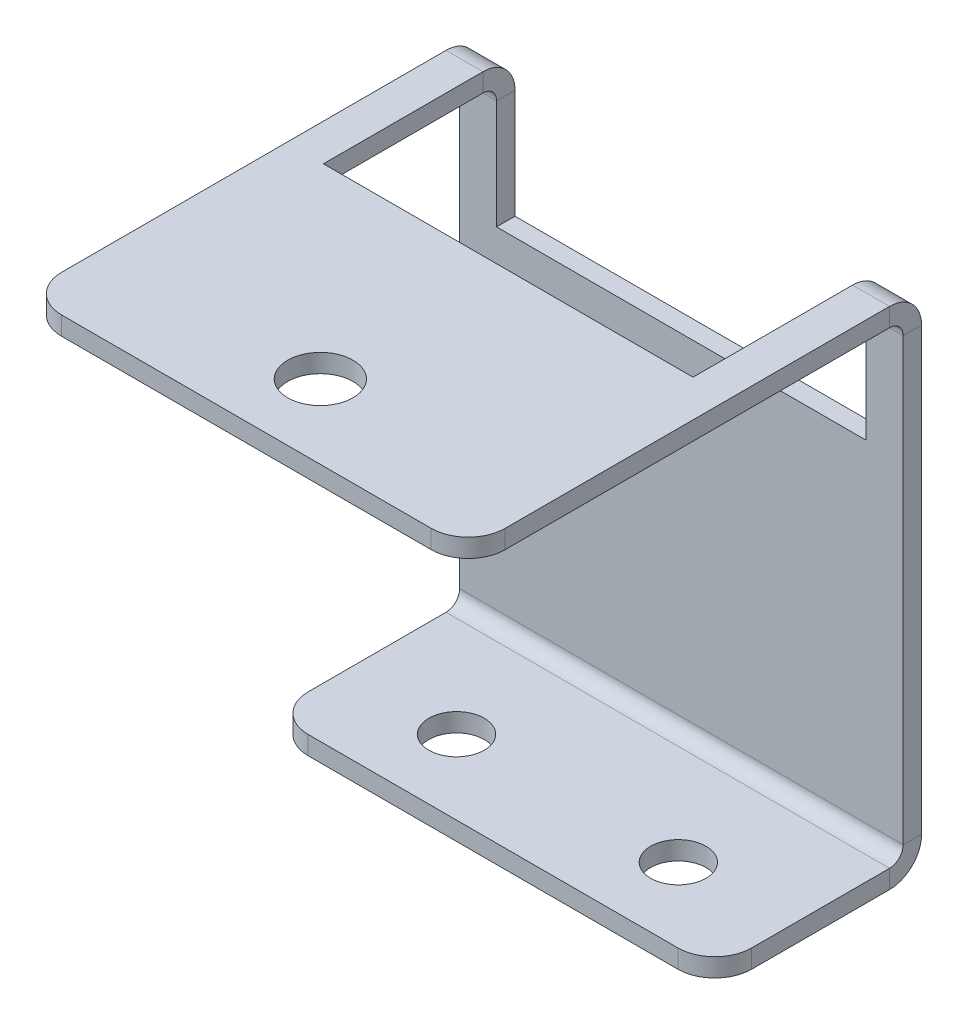
ISO-10303-21;
HEADER;
FILE_DESCRIPTION(('STEP AP214'),'2;1');
FILE_NAME('part.step','',(''),(''),'','','');
FILE_SCHEMA(('AUTOMOTIVE_DESIGN { 1 0 10303 214 1 1 1 1 }'));
ENDSEC;
DATA;
#1=APPLICATION_CONTEXT('core data for automotive mechanical design processes');
#2=APPLICATION_PROTOCOL_DEFINITION('international standard','automotive_design',2000,#1);
#3=PRODUCT_CONTEXT('',#1,'mechanical');
#4=PRODUCT('Part','Part','',(#3));
#5=PRODUCT_RELATED_PRODUCT_CATEGORY('part','',(#4));
#6=PRODUCT_DEFINITION_FORMATION('','',#4);
#7=PRODUCT_DEFINITION_CONTEXT('part definition',#1,'design');
#8=PRODUCT_DEFINITION('design','',#6,#7);
#9=PRODUCT_DEFINITION_SHAPE('','',#8);
#10=(LENGTH_UNIT() NAMED_UNIT(*) SI_UNIT(.MILLI.,.METRE.));
#11=(NAMED_UNIT(*) PLANE_ANGLE_UNIT() SI_UNIT($,.RADIAN.));
#12=(NAMED_UNIT(*) SI_UNIT($,.STERADIAN.) SOLID_ANGLE_UNIT());
#13=UNCERTAINTY_MEASURE_WITH_UNIT(LENGTH_MEASURE(1.E-05),#10,'distance_accuracy_value','');
#14=(GEOMETRIC_REPRESENTATION_CONTEXT(3) GLOBAL_UNCERTAINTY_ASSIGNED_CONTEXT((#13)) GLOBAL_UNIT_ASSIGNED_CONTEXT((#10,
#11,#12)) REPRESENTATION_CONTEXT('',''));
#15=CARTESIAN_POINT('',(0.,0.,0.));
#16=DIRECTION('',(0.,0.,1.));
#17=DIRECTION('',(1.,0.,0.));
#18=AXIS2_PLACEMENT_3D('',#15,#16,#17);
#19=CARTESIAN_POINT('',(-17.245017891848,-41.98679348364,-1.));
#20=DIRECTION('',(0.,0.,1.));
#21=DIRECTION('',(1.,0.,0.));
#22=AXIS2_PLACEMENT_3D('',#19,#20,#21);
#23=PLANE('',#22);
#24=DIRECTION('',(0.,-1.,0.));
#25=VECTOR('',#24,1.);
#26=CARTESIAN_POINT('',(-19.245017891848,14.01320651636,-1.));
#27=LINE('',#26,#25);
#28=CARTESIAN_POINT('',(-19.245017891848,-8.7292653526373,-1.));
#29=VERTEX_POINT('',#28);
#30=CARTESIAN_POINT('',(-19.245017891848,-32.58974198378,-0.999999999999999));
#31=VERTEX_POINT('',#30);
#32=EDGE_CURVE('E346',#29,#31,#27,.T.);
#33=ORIENTED_EDGE('',*,*,#32,.F.);
#34=DIRECTION('',(1.,0.,0.));
#35=VECTOR('',#34,1.);
#36=CARTESIAN_POINT('',(-17.245017891848,-8.72926535263729,-1.));
#37=LINE('',#36,#35);
#38=CARTESIAN_POINT('',(-17.245017891848,-8.72926535263729,-1.));
#39=VERTEX_POINT('',#38);
#40=EDGE_CURVE('E423',#29,#39,#37,.T.);
#41=ORIENTED_EDGE('',*,*,#40,.T.);
#42=DIRECTION('',(0.,-1.,0.));
#43=VECTOR('',#42,1.);
#44=CARTESIAN_POINT('',(-17.245017891848,-14.6335342843049,-1.));
#45=LINE('',#44,#43);
#46=CARTESIAN_POINT('',(-17.245017891848,-14.6335342843049,-1.));
#47=VERTEX_POINT('',#46);
#48=EDGE_CURVE('E347',#39,#47,#45,.T.);
#49=ORIENTED_EDGE('',*,*,#48,.T.);
#50=DIRECTION('',(1.,0.,0.));
#51=VECTOR('',#50,1.);
#52=CARTESIAN_POINT('',(2.75498210815198,-14.6335342843049,-1.));
#53=LINE('',#52,#51);
#54=CARTESIAN_POINT('',(2.75498210815198,-14.6335342843049,-1.));
#55=VERTEX_POINT('',#54);
#56=EDGE_CURVE('E348',#47,#55,#53,.T.);
#57=ORIENTED_EDGE('',*,*,#56,.T.);
#58=DIRECTION('',(0.,1.,0.));
#59=VECTOR('',#58,1.);
#60=CARTESIAN_POINT('',(2.75498210815197,1.84429695847216,-1.));
#61=LINE('',#60,#59);
#62=CARTESIAN_POINT('',(2.75498210815198,-8.72926535263729,-1.));
#63=VERTEX_POINT('',#62);
#64=EDGE_CURVE('E51',#55,#63,#61,.T.);
#65=ORIENTED_EDGE('',*,*,#64,.T.);
#66=DIRECTION('',(1.,0.,0.));
#67=VECTOR('',#66,1.);
#68=CARTESIAN_POINT('',(-17.245017891848,-8.72926535263729,-1.));
#69=LINE('',#68,#67);
#70=CARTESIAN_POINT('',(4.75498210815198,-8.72926535263728,-1.));
#71=VERTEX_POINT('',#70);
#72=EDGE_CURVE('E438',#63,#71,#69,.T.);
#73=ORIENTED_EDGE('',*,*,#72,.T.);
#74=DIRECTION('',(0.,1.,0.));
#75=VECTOR('',#74,1.);
#76=CARTESIAN_POINT('',(4.75498210815199,-41.98679348364,-1.));
#77=LINE('',#76,#75);
#78=CARTESIAN_POINT('',(4.75498210815199,-32.58974198378,-1.));
#79=VERTEX_POINT('',#78);
#80=EDGE_CURVE('E375',#79,#71,#77,.T.);
#81=ORIENTED_EDGE('',*,*,#80,.F.);
#82=DIRECTION('',(-1.,0.,0.));
#83=VECTOR('',#82,1.);
#84=CARTESIAN_POINT('',(-17.245017891848,-32.58974198378,-1.));
#85=LINE('',#84,#83);
#86=EDGE_CURVE('E343',#79,#31,#85,.T.);
#87=ORIENTED_EDGE('',*,*,#86,.T.);
#88=EDGE_LOOP('',(#33,#41,#49,#57,#65,#73,#81,#87));
#89=FACE_BOUND('',#88,.T.);
#90=ADVANCED_FACE('F47',(#89),#23,.F.);
#91=CARTESIAN_POINT('',(2.75498210815197,1.84429695847216,-1.));
#92=DIRECTION('',(1.,0.,0.));
#93=DIRECTION('',(0.,1.,0.));
#94=AXIS2_PLACEMENT_3D('',#91,#92,#93);
#95=PLANE('',#94);
#96=DIRECTION('',(0.,1.,0.));
#97=VECTOR('',#96,1.);
#98=CARTESIAN_POINT('',(2.75498210815197,1.84429695847216,0.));
#99=LINE('',#98,#97);
#100=CARTESIAN_POINT('',(2.75498210815198,-14.6335342843049,0.));
#101=VERTEX_POINT('',#100);
#102=CARTESIAN_POINT('',(2.75498210815198,-8.72926535263729,0.));
#103=VERTEX_POINT('',#102);
#104=EDGE_CURVE('E72',#101,#103,#99,.T.);
#105=ORIENTED_EDGE('',*,*,#104,.T.);
#106=DIRECTION('',(0.,0.,-1.));
#107=VECTOR('',#106,1.);
#108=CARTESIAN_POINT('',(2.75498210815198,-8.72926535263729,-1.00000000000007));
#109=LINE('',#108,#107);
#110=EDGE_CURVE('E441',#103,#63,#109,.T.);
#111=ORIENTED_EDGE('',*,*,#110,.T.);
#112=ORIENTED_EDGE('',*,*,#64,.F.);
#113=DIRECTION('',(0.,0.,1.));
#114=VECTOR('',#113,1.);
#115=CARTESIAN_POINT('',(2.75498210815198,-14.6335342843049,-1.));
#116=LINE('',#115,#114);
#117=EDGE_CURVE('E357',#55,#101,#116,.T.);
#118=ORIENTED_EDGE('',*,*,#117,.T.);
#119=EDGE_LOOP('',(#105,#111,#112,#118));
#120=FACE_BOUND('',#119,.T.);
#121=ADVANCED_FACE('F460',(#120),#95,.F.);
#122=CARTESIAN_POINT('',(-17.245017891848,-14.6335342843049,-1.));
#123=DIRECTION('',(-1.,0.,0.));
#124=DIRECTION('',(0.,0.,1.));
#125=AXIS2_PLACEMENT_3D('',#122,#123,#124);
#126=PLANE('',#125);
#127=ORIENTED_EDGE('',*,*,#48,.F.);
#128=DIRECTION('',(0.,0.,1.));
#129=VECTOR('',#128,1.);
#130=CARTESIAN_POINT('',(-17.245017891848,-8.72926535263729,-0.999999999999959));
#131=LINE('',#130,#129);
#132=CARTESIAN_POINT('',(-17.245017891848,-8.72926535263729,0.));
#133=VERTEX_POINT('',#132);
#134=EDGE_CURVE('E435',#39,#133,#131,.T.);
#135=ORIENTED_EDGE('',*,*,#134,.T.);
#136=DIRECTION('',(0.,-1.,0.));
#137=VECTOR('',#136,1.);
#138=CARTESIAN_POINT('',(-17.245017891848,-14.6335342843049,0.));
#139=LINE('',#138,#137);
#140=CARTESIAN_POINT('',(-17.245017891848,-14.6335342843049,0.));
#141=VERTEX_POINT('',#140);
#142=EDGE_CURVE('E362',#133,#141,#139,.T.);
#143=ORIENTED_EDGE('',*,*,#142,.T.);
#144=DIRECTION('',(0.,0.,1.));
#145=VECTOR('',#144,1.);
#146=CARTESIAN_POINT('',(-17.245017891848,-14.6335342843049,-1.));
#147=LINE('',#146,#145);
#148=EDGE_CURVE('E351',#47,#141,#147,.T.);
#149=ORIENTED_EDGE('',*,*,#148,.F.);
#150=EDGE_LOOP('',(#127,#135,#143,#149));
#151=FACE_BOUND('',#150,.T.);
#152=ADVANCED_FACE('F49',(#151),#126,.F.);
#153=CARTESIAN_POINT('',(-19.245017891848,-34.3263419837802,-47.8087952378546));
#154=DIRECTION('',(-1.,0.,0.));
#155=DIRECTION('',(0.,0.,1.));
#156=AXIS2_PLACEMENT_3D('',#153,#154,#155);
#157=PLANE('',#156);
#158=DIRECTION('',(0.,0.,1.));
#159=VECTOR('',#158,1.);
#160=CARTESIAN_POINT('',(-19.245017891848,-33.3263419837802,-47.8087952378546));
#161=LINE('',#160,#159);
#162=CARTESIAN_POINT('',(-19.245017891848,-33.32634198378,0.736600000000004));
#163=VERTEX_POINT('',#162);
#164=CARTESIAN_POINT('',(-19.245017891848,-33.32634198378,8.19120476214537));
#165=VERTEX_POINT('',#164);
#166=EDGE_CURVE('E386',#163,#165,#161,.T.);
#167=ORIENTED_EDGE('',*,*,#166,.F.);
#168=DIRECTION('',(0.,-1.,0.));
#169=VECTOR('',#168,1.);
#170=CARTESIAN_POINT('',(-19.245017891848,-34.3263419837804,0.736600000000004));
#171=LINE('',#170,#169);
#172=CARTESIAN_POINT('',(-19.245017891848,-34.32634198378,0.736600000000002));
#173=VERTEX_POINT('',#172);
#174=EDGE_CURVE('E415',#163,#173,#171,.T.);
#175=ORIENTED_EDGE('',*,*,#174,.T.);
#176=DIRECTION('',(0.,0.,1.));
#177=VECTOR('',#176,1.);
#178=CARTESIAN_POINT('',(-19.245017891848,-34.3263419837802,-47.8087952378546));
#179=LINE('',#178,#177);
#180=CARTESIAN_POINT('',(-19.245017891848,-34.32634198378,8.19120476214538));
#181=VERTEX_POINT('',#180);
#182=EDGE_CURVE('E412',#173,#181,#179,.T.);
#183=ORIENTED_EDGE('',*,*,#182,.T.);
#184=DIRECTION('',(0.,1.,0.));
#185=VECTOR('',#184,1.);
#186=CARTESIAN_POINT('',(-19.245017891848,-34.32634198378,8.19120476214538));
#187=LINE('',#186,#185);
#188=EDGE_CURVE('E402',#181,#165,#187,.T.);
#189=ORIENTED_EDGE('',*,*,#188,.T.);
#190=EDGE_LOOP('',(#167,#175,#183,#189));
#191=FACE_BOUND('',#190,.T.);
#192=ADVANCED_FACE('F508',(#191),#157,.T.);
#193=CARTESIAN_POINT('',(4.75498210815199,-34.32634198378,8.19120476214538));
#194=DIRECTION('',(1.,0.,0.));
#195=DIRECTION('',(0.,0.,-1.));
#196=AXIS2_PLACEMENT_3D('',#193,#194,#195);
#197=PLANE('',#196);
#198=DIRECTION('',(0.,0.,-1.));
#199=VECTOR('',#198,1.);
#200=CARTESIAN_POINT('',(4.75498210815199,-34.32634198378,8.19120476214538));
#201=LINE('',#200,#199);
#202=CARTESIAN_POINT('',(4.75498210815199,-34.32634198378,8.19120476214538));
#203=VERTEX_POINT('',#202);
#204=CARTESIAN_POINT('',(4.75498210815199,-34.32634198378,0.736600000000004));
#205=VERTEX_POINT('',#204);
#206=EDGE_CURVE('E392',#203,#205,#201,.T.);
#207=ORIENTED_EDGE('',*,*,#206,.T.);
#208=DIRECTION('',(0.,1.,0.));
#209=VECTOR('',#208,1.);
#210=CARTESIAN_POINT('',(4.75498210815199,-34.32634198378,0.736600000000004));
#211=LINE('',#210,#209);
#212=CARTESIAN_POINT('',(4.75498210815199,-33.32634198378,0.736600000000004));
#213=VERTEX_POINT('',#212);
#214=EDGE_CURVE('E420',#205,#213,#211,.T.);
#215=ORIENTED_EDGE('',*,*,#214,.T.);
#216=DIRECTION('',(0.,0.,-1.));
#217=VECTOR('',#216,1.);
#218=CARTESIAN_POINT('',(4.75498210815199,-33.32634198378,8.19120476214537));
#219=LINE('',#218,#217);
#220=CARTESIAN_POINT('',(4.75498210815199,-33.32634198378,8.19120476214537));
#221=VERTEX_POINT('',#220);
#222=EDGE_CURVE('E401',#221,#213,#219,.T.);
#223=ORIENTED_EDGE('',*,*,#222,.F.);
#224=DIRECTION('',(0.,1.,0.));
#225=VECTOR('',#224,1.);
#226=CARTESIAN_POINT('',(4.75498210815199,-34.32634198378,8.19120476214538));
#227=LINE('',#226,#225);
#228=EDGE_CURVE('E406',#203,#221,#227,.T.);
#229=ORIENTED_EDGE('',*,*,#228,.F.);
#230=EDGE_LOOP('',(#207,#215,#223,#229));
#231=FACE_BOUND('',#230,.T.);
#232=ADVANCED_FACE('F497',(#231),#197,.T.);
#233=CARTESIAN_POINT('',(-17.245017891848,-33.32634198378,8.19120476214538));
#234=DIRECTION('',(0.,1.,0.));
#235=DIRECTION('',(1.,0.,0.));
#236=AXIS2_PLACEMENT_3D('',#233,#234,#235);
#237=PLANE('',#236);
#238=CARTESIAN_POINT('',(-13.245017891848,-33.32634198378,6.16537663114272));
#239=DIRECTION('',(0.,1.,0.));
#240=DIRECTION('',(1.,0.,0.));
#241=AXIS2_PLACEMENT_3D('',#238,#239,#240);
#242=CIRCLE('',#241,1.5);
#243=CARTESIAN_POINT('',(-11.745017891848,-33.32634198378,6.16537663114272));
#244=VERTEX_POINT('',#243);
#245=EDGE_CURVE('E371',#244,#244,#242,.T.);
#246=ORIENTED_EDGE('',*,*,#245,.F.);
#247=EDGE_LOOP('',(#246));
#248=FACE_BOUND('',#247,.T.);
#249=CARTESIAN_POINT('',(-1.24501789184801,-33.32634198378,6.16537663114272));
#250=DIRECTION('',(0.,1.,0.));
#251=DIRECTION('',(1.,0.,0.));
#252=AXIS2_PLACEMENT_3D('',#249,#250,#251);
#253=CIRCLE('',#252,1.5);
#254=CARTESIAN_POINT('',(0.254982108151987,-33.32634198378,6.16537663114272));
#255=VERTEX_POINT('',#254);
#256=EDGE_CURVE('E372',#255,#255,#253,.T.);
#257=ORIENTED_EDGE('',*,*,#256,.F.);
#258=EDGE_LOOP('',(#257));
#259=FACE_BOUND('',#258,.T.);
#260=ORIENTED_EDGE('',*,*,#222,.T.);
#261=DIRECTION('',(-1.,0.,0.));
#262=VECTOR('',#261,1.);
#263=CARTESIAN_POINT('',(-17.245017891848,-33.32634198378,0.736600000000004));
#264=LINE('',#263,#262);
#265=EDGE_CURVE('E417',#213,#163,#264,.T.);
#266=ORIENTED_EDGE('',*,*,#265,.T.);
#267=ORIENTED_EDGE('',*,*,#166,.T.);
#268=CARTESIAN_POINT('',(-17.245017891848,-33.32634198378,8.19120476214538));
#269=DIRECTION('',(0.,1.,0.));
#270=DIRECTION('',(1.,0.,0.));
#271=AXIS2_PLACEMENT_3D('',#268,#269,#270);
#272=CIRCLE('',#271,2.);
#273=CARTESIAN_POINT('',(-17.245017891848,-33.32634198378,10.1912047621454));
#274=VERTEX_POINT('',#273);
#275=EDGE_CURVE('E379',#165,#274,#272,.T.);
#276=ORIENTED_EDGE('',*,*,#275,.T.);
#277=DIRECTION('',(1.,0.,0.));
#278=VECTOR('',#277,1.);
#279=CARTESIAN_POINT('',(-17.245017891848,-33.32634198378,10.1912047621454));
#280=LINE('',#279,#278);
#281=CARTESIAN_POINT('',(2.75498210815198,-33.32634198378,10.1912047621454));
#282=VERTEX_POINT('',#281);
#283=EDGE_CURVE('E395',#274,#282,#280,.T.);
#284=ORIENTED_EDGE('',*,*,#283,.T.);
#285=CARTESIAN_POINT('',(2.75498210815199,-33.32634198378,8.19120476214538));
#286=DIRECTION('',(0.,1.,0.));
#287=DIRECTION('',(-1.,0.,0.));
#288=AXIS2_PLACEMENT_3D('',#285,#286,#287);
#289=CIRCLE('',#288,2.);
#290=EDGE_CURVE('E398',#282,#221,#289,.T.);
#291=ORIENTED_EDGE('',*,*,#290,.T.);
#292=EDGE_LOOP('',(#260,#266,#267,#276,#284,#291));
#293=FACE_BOUND('',#292,.T.);
#294=ADVANCED_FACE('F506',(#248,#259,#293),#237,.T.);
#295=CARTESIAN_POINT('',(-17.245017891848,-34.32634198378,8.19120476214539));
#296=DIRECTION('',(0.,1.,0.));
#297=DIRECTION('',(1.,0.,0.));
#298=AXIS2_PLACEMENT_3D('',#295,#296,#297);
#299=CYLINDRICAL_SURFACE('',#298,2.);
#300=ORIENTED_EDGE('',*,*,#275,.F.);
#301=ORIENTED_EDGE('',*,*,#188,.F.);
#302=CARTESIAN_POINT('',(-17.245017891848,-34.32634198378,8.19120476214539));
#303=DIRECTION('',(0.,1.,0.));
#304=DIRECTION('',(1.,0.,0.));
#305=AXIS2_PLACEMENT_3D('',#302,#303,#304);
#306=CIRCLE('',#305,2.);
#307=CARTESIAN_POINT('',(-17.245017891848,-34.32634198378,10.1912047621454));
#308=VERTEX_POINT('',#307);
#309=EDGE_CURVE('E382',#181,#308,#306,.T.);
#310=ORIENTED_EDGE('',*,*,#309,.T.);
#311=DIRECTION('',(0.,1.,0.));
#312=VECTOR('',#311,1.);
#313=CARTESIAN_POINT('',(-17.245017891848,-34.32634198378,10.1912047621454));
#314=LINE('',#313,#312);
#315=EDGE_CURVE('E410',#308,#274,#314,.T.);
#316=ORIENTED_EDGE('',*,*,#315,.T.);
#317=EDGE_LOOP('',(#300,#301,#310,#316));
#318=FACE_BOUND('',#317,.T.);
#319=ADVANCED_FACE('F512',(#318),#299,.T.);
#320=CARTESIAN_POINT('',(2.75498210815199,-34.32634198378,8.19120476214539));
#321=DIRECTION('',(0.,1.,0.));
#322=DIRECTION('',(1.,0.,0.));
#323=AXIS2_PLACEMENT_3D('',#320,#321,#322);
#324=CYLINDRICAL_SURFACE('',#323,2.);
#325=ORIENTED_EDGE('',*,*,#290,.F.);
#326=DIRECTION('',(0.,1.,0.));
#327=VECTOR('',#326,1.);
#328=CARTESIAN_POINT('',(2.75498210815198,-34.32634198378,10.1912047621454));
#329=LINE('',#328,#327);
#330=CARTESIAN_POINT('',(2.75498210815198,-34.32634198378,10.1912047621454));
#331=VERTEX_POINT('',#330);
#332=EDGE_CURVE('E408',#331,#282,#329,.T.);
#333=ORIENTED_EDGE('',*,*,#332,.F.);
#334=CARTESIAN_POINT('',(2.75498210815199,-34.32634198378,8.19120476214539));
#335=DIRECTION('',(0.,1.,0.));
#336=DIRECTION('',(-1.,0.,0.));
#337=AXIS2_PLACEMENT_3D('',#334,#335,#336);
#338=CIRCLE('',#337,2.);
#339=EDGE_CURVE('E389',#331,#203,#338,.T.);
#340=ORIENTED_EDGE('',*,*,#339,.T.);
#341=ORIENTED_EDGE('',*,*,#228,.T.);
#342=EDGE_LOOP('',(#325,#333,#340,#341));
#343=FACE_BOUND('',#342,.T.);
#344=ADVANCED_FACE('F519',(#343),#324,.T.);
#345=CARTESIAN_POINT('',(-17.245017891848,-34.32634198378,10.1912047621454));
#346=DIRECTION('',(0.,0.,1.));
#347=DIRECTION('',(0.,-1.,0.));
#348=AXIS2_PLACEMENT_3D('',#345,#346,#347);
#349=PLANE('',#348);
#350=ORIENTED_EDGE('',*,*,#283,.F.);
#351=ORIENTED_EDGE('',*,*,#315,.F.);
#352=DIRECTION('',(1.,0.,0.));
#353=VECTOR('',#352,1.);
#354=CARTESIAN_POINT('',(-17.245017891848,-34.32634198378,10.1912047621454));
#355=LINE('',#354,#353);
#356=EDGE_CURVE('E385',#308,#331,#355,.T.);
#357=ORIENTED_EDGE('',*,*,#356,.T.);
#358=ORIENTED_EDGE('',*,*,#332,.T.);
#359=EDGE_LOOP('',(#350,#351,#357,#358));
#360=FACE_BOUND('',#359,.T.);
#361=ADVANCED_FACE('F516',(#360),#349,.T.);
#362=CARTESIAN_POINT('',(-17.245017891848,-34.32634198378,8.19120476214539));
#363=DIRECTION('',(0.,1.,0.));
#364=DIRECTION('',(1.,0.,0.));
#365=AXIS2_PLACEMENT_3D('',#362,#363,#364);
#366=PLANE('',#365);
#367=DIRECTION('',(-1.,0.,0.));
#368=VECTOR('',#367,1.);
#369=CARTESIAN_POINT('',(-17.245017891848,-34.32634198378,0.736600000000004));
#370=LINE('',#369,#368);
#371=EDGE_CURVE('E405',#205,#173,#370,.T.);
#372=ORIENTED_EDGE('',*,*,#371,.F.);
#373=ORIENTED_EDGE('',*,*,#206,.F.);
#374=ORIENTED_EDGE('',*,*,#339,.F.);
#375=ORIENTED_EDGE('',*,*,#356,.F.);
#376=ORIENTED_EDGE('',*,*,#309,.F.);
#377=ORIENTED_EDGE('',*,*,#182,.F.);
#378=EDGE_LOOP('',(#372,#373,#374,#375,#376,#377));
#379=FACE_BOUND('',#378,.T.);
#380=CARTESIAN_POINT('',(-1.24501789184801,-34.32634198378,6.16537663114273));
#381=DIRECTION('',(0.,1.,0.));
#382=DIRECTION('',(1.,0.,0.));
#383=AXIS2_PLACEMENT_3D('',#380,#381,#382);
#384=CIRCLE('',#383,1.5);
#385=CARTESIAN_POINT('',(0.254982108151987,-34.32634198378,6.16537663114273));
#386=VERTEX_POINT('',#385);
#387=EDGE_CURVE('E368',#386,#386,#384,.T.);
#388=ORIENTED_EDGE('',*,*,#387,.T.);
#389=EDGE_LOOP('',(#388));
#390=FACE_BOUND('',#389,.T.);
#391=CARTESIAN_POINT('',(-13.245017891848,-34.32634198378,6.16537663114273));
#392=DIRECTION('',(0.,1.,0.));
#393=DIRECTION('',(1.,0.,0.));
#394=AXIS2_PLACEMENT_3D('',#391,#392,#393);
#395=CIRCLE('',#394,1.5);
#396=CARTESIAN_POINT('',(-11.745017891848,-34.32634198378,6.16537663114273));
#397=VERTEX_POINT('',#396);
#398=EDGE_CURVE('E376',#397,#397,#395,.T.);
#399=ORIENTED_EDGE('',*,*,#398,.T.);
#400=EDGE_LOOP('',(#399));
#401=FACE_BOUND('',#400,.T.);
#402=ADVANCED_FACE('F491',(#379,#390,#401),#366,.F.);
#403=CARTESIAN_POINT('',(-13.245017891848,-34.32634198378,6.16537663114273));
#404=DIRECTION('',(0.,1.,0.));
#405=DIRECTION('',(1.,0.,0.));
#406=AXIS2_PLACEMENT_3D('',#403,#404,#405);
#407=CYLINDRICAL_SURFACE('',#406,1.5);
#408=ORIENTED_EDGE('',*,*,#398,.F.);
#409=EDGE_LOOP('',(#408));
#410=FACE_BOUND('',#409,.T.);
#411=ORIENTED_EDGE('',*,*,#245,.T.);
#412=EDGE_LOOP('',(#411));
#413=FACE_BOUND('',#412,.T.);
#414=ADVANCED_FACE('F619',(#410,#413),#407,.F.);
#415=CARTESIAN_POINT('',(-1.24501789184801,-34.32634198378,6.16537663114273));
#416=DIRECTION('',(0.,1.,0.));
#417=DIRECTION('',(1.,0.,0.));
#418=AXIS2_PLACEMENT_3D('',#415,#416,#417);
#419=CYLINDRICAL_SURFACE('',#418,1.5);
#420=ORIENTED_EDGE('',*,*,#387,.F.);
#421=EDGE_LOOP('',(#420));
#422=FACE_BOUND('',#421,.T.);
#423=ORIENTED_EDGE('',*,*,#256,.T.);
#424=EDGE_LOOP('',(#423));
#425=FACE_BOUND('',#424,.T.);
#426=ADVANCED_FACE('F548',(#422,#425),#419,.F.);
#427=CARTESIAN_POINT('',(2.75498210815198,-14.6335342843049,-1.));
#428=DIRECTION('',(0.,-1.,0.));
#429=DIRECTION('',(1.,0.,0.));
#430=AXIS2_PLACEMENT_3D('',#427,#428,#429);
#431=PLANE('',#430);
#432=DIRECTION('',(1.,0.,0.));
#433=VECTOR('',#432,1.);
#434=CARTESIAN_POINT('',(2.75498210815198,-14.6335342843049,0.));
#435=LINE('',#434,#433);
#436=EDGE_CURVE('E354',#141,#101,#435,.T.);
#437=ORIENTED_EDGE('',*,*,#436,.T.);
#438=ORIENTED_EDGE('',*,*,#117,.F.);
#439=ORIENTED_EDGE('',*,*,#56,.F.);
#440=ORIENTED_EDGE('',*,*,#148,.T.);
#441=EDGE_LOOP('',(#437,#438,#439,#440));
#442=FACE_BOUND('',#441,.T.);
#443=ADVANCED_FACE('F544',(#442),#431,.F.);
#444=CARTESIAN_POINT('',(-19.245017891848,14.01320651636,-1.));
#445=DIRECTION('',(-1.,0.,0.));
#446=DIRECTION('',(0.,-1.,0.));
#447=AXIS2_PLACEMENT_3D('',#444,#445,#446);
#448=PLANE('',#447);
#449=DIRECTION('',(0.,0.,1.));
#450=VECTOR('',#449,1.);
#451=CARTESIAN_POINT('',(-19.245017891848,-8.72926535263729,-1.00000000000016));
#452=LINE('',#451,#450);
#453=CARTESIAN_POINT('',(-19.245017891848,-8.72926535263729,0.));
#454=VERTEX_POINT('',#453);
#455=EDGE_CURVE('E431',#29,#454,#452,.T.);
#456=ORIENTED_EDGE('',*,*,#455,.F.);
#457=ORIENTED_EDGE('',*,*,#32,.T.);
#458=DIRECTION('',(0.,0.,-1.));
#459=VECTOR('',#458,1.);
#460=CARTESIAN_POINT('',(-19.245017891848,-32.58974198378,-1.00000000000033));
#461=LINE('',#460,#459);
#462=CARTESIAN_POINT('',(-19.245017891848,-32.58974198378,0.));
#463=VERTEX_POINT('',#462);
#464=EDGE_CURVE('E359',#463,#31,#461,.T.);
#465=ORIENTED_EDGE('',*,*,#464,.F.);
#466=DIRECTION('',(0.,-1.,0.));
#467=VECTOR('',#466,1.);
#468=CARTESIAN_POINT('',(-19.245017891848,14.01320651636,0.));
#469=LINE('',#468,#467);
#470=EDGE_CURVE('E448',#454,#463,#469,.T.);
#471=ORIENTED_EDGE('',*,*,#470,.F.);
#472=EDGE_LOOP('',(#456,#457,#465,#471));
#473=FACE_BOUND('',#472,.T.);
#474=ADVANCED_FACE('F541',(#473),#448,.T.);
#475=CARTESIAN_POINT('',(-17.245017891848,-41.98679348364,0.));
#476=DIRECTION('',(0.,0.,1.));
#477=DIRECTION('',(1.,0.,0.));
#478=AXIS2_PLACEMENT_3D('',#475,#476,#477);
#479=PLANE('',#478);
#480=DIRECTION('',(1.,0.,0.));
#481=VECTOR('',#480,1.);
#482=CARTESIAN_POINT('',(-17.245017891848,-8.7292653526373,0.));
#483=LINE('',#482,#481);
#484=EDGE_CURVE('E433',#454,#133,#483,.T.);
#485=ORIENTED_EDGE('',*,*,#484,.F.);
#486=ORIENTED_EDGE('',*,*,#470,.T.);
#487=DIRECTION('',(-1.,0.,0.));
#488=VECTOR('',#487,1.);
#489=CARTESIAN_POINT('',(-17.245017891848,-32.58974198378,0.));
#490=LINE('',#489,#488);
#491=CARTESIAN_POINT('',(4.75498210815199,-32.58974198378,0.));
#492=VERTEX_POINT('',#491);
#493=EDGE_CURVE('E363',#492,#463,#490,.T.);
#494=ORIENTED_EDGE('',*,*,#493,.F.);
#495=DIRECTION('',(0.,1.,0.));
#496=VECTOR('',#495,1.);
#497=CARTESIAN_POINT('',(4.75498210815199,-41.98679348364,0.));
#498=LINE('',#497,#496);
#499=CARTESIAN_POINT('',(4.75498210815198,-8.7292653526373,0.));
#500=VERTEX_POINT('',#499);
#501=EDGE_CURVE('E64',#492,#500,#498,.T.);
#502=ORIENTED_EDGE('',*,*,#501,.T.);
#503=DIRECTION('',(1.,0.,0.));
#504=VECTOR('',#503,1.);
#505=CARTESIAN_POINT('',(-17.245017891848,-8.7292653526373,0.));
#506=LINE('',#505,#504);
#507=EDGE_CURVE('E56',#103,#500,#506,.T.);
#508=ORIENTED_EDGE('',*,*,#507,.F.);
#509=ORIENTED_EDGE('',*,*,#104,.F.);
#510=ORIENTED_EDGE('',*,*,#436,.F.);
#511=ORIENTED_EDGE('',*,*,#142,.F.);
#512=EDGE_LOOP('',(#485,#486,#494,#502,#508,#509,#510,#511));
#513=FACE_BOUND('',#512,.T.);
#514=ADVANCED_FACE('F538',(#513),#479,.T.);
#515=CARTESIAN_POINT('',(4.75498210815199,-41.98679348364,-1.));
#516=DIRECTION('',(1.,0.,0.));
#517=DIRECTION('',(0.,1.,0.));
#518=AXIS2_PLACEMENT_3D('',#515,#516,#517);
#519=PLANE('',#518);
#520=DIRECTION('',(0.,0.,-1.));
#521=VECTOR('',#520,1.);
#522=CARTESIAN_POINT('',(4.75498210815198,-8.72926535263729,-0.999999999999768));
#523=LINE('',#522,#521);
#524=EDGE_CURVE('E12',#500,#71,#523,.T.);
#525=ORIENTED_EDGE('',*,*,#524,.F.);
#526=ORIENTED_EDGE('',*,*,#501,.F.);
#527=DIRECTION('',(0.,0.,1.));
#528=VECTOR('',#527,1.);
#529=CARTESIAN_POINT('',(4.75498210815199,-32.58974198378,-0.999999999999934));
#530=LINE('',#529,#528);
#531=EDGE_CURVE('E338',#79,#492,#530,.T.);
#532=ORIENTED_EDGE('',*,*,#531,.F.);
#533=ORIENTED_EDGE('',*,*,#80,.T.);
#534=EDGE_LOOP('',(#525,#526,#532,#533));
#535=FACE_BOUND('',#534,.T.);
#536=ADVANCED_FACE('F473',(#535),#519,.T.);
#537=CARTESIAN_POINT('',(4.75498210815199,-32.58974198378,0.7366));
#538=DIRECTION('',(1.,0.,0.));
#539=DIRECTION('',(0.,0.,-1.));
#540=AXIS2_PLACEMENT_3D('',#537,#538,#539);
#541=PLANE('',#540);
#542=ORIENTED_EDGE('',*,*,#531,.T.);
#543=CARTESIAN_POINT('',(4.75498210815199,-32.58974198378,0.7366));
#544=DIRECTION('',(-1.,0.,0.));
#545=DIRECTION('',(0.,0.,1.));
#546=AXIS2_PLACEMENT_3D('',#543,#544,#545);
#547=CIRCLE('',#546,0.7366);
#548=EDGE_CURVE('E326',#492,#213,#547,.T.);
#549=ORIENTED_EDGE('',*,*,#548,.T.);
#550=ORIENTED_EDGE('',*,*,#214,.F.);
#551=CARTESIAN_POINT('',(4.75498210815199,-32.58974198378,0.7366));
#552=DIRECTION('',(-1.,0.,0.));
#553=DIRECTION('',(0.,0.,-1.));
#554=AXIS2_PLACEMENT_3D('',#551,#552,#553);
#555=CIRCLE('',#554,1.7366);
#556=EDGE_CURVE('E331',#79,#205,#555,.T.);
#557=ORIENTED_EDGE('',*,*,#556,.F.);
#558=EDGE_LOOP('',(#542,#549,#550,#557));
#559=FACE_BOUND('',#558,.T.);
#560=ADVANCED_FACE('F501',(#559),#541,.T.);
#561=CARTESIAN_POINT('',(-19.245017891848,-32.58974198378,0.7366));
#562=DIRECTION('',(-1.,0.,0.));
#563=DIRECTION('',(0.,0.,1.));
#564=AXIS2_PLACEMENT_3D('',#561,#562,#563);
#565=PLANE('',#564);
#566=ORIENTED_EDGE('',*,*,#174,.F.);
#567=CARTESIAN_POINT('',(-19.245017891848,-32.58974198378,0.7366));
#568=DIRECTION('',(-1.,0.,0.));
#569=DIRECTION('',(0.,0.,1.));
#570=AXIS2_PLACEMENT_3D('',#567,#568,#569);
#571=CIRCLE('',#570,0.7366);
#572=EDGE_CURVE('E335',#163,#463,#571,.F.);
#573=ORIENTED_EDGE('',*,*,#572,.T.);
#574=ORIENTED_EDGE('',*,*,#464,.T.);
#575=CARTESIAN_POINT('',(-19.245017891848,-32.58974198378,0.7366));
#576=DIRECTION('',(1.,0.,0.));
#577=DIRECTION('',(0.,0.,1.));
#578=AXIS2_PLACEMENT_3D('',#575,#576,#577);
#579=CIRCLE('',#578,1.7366);
#580=EDGE_CURVE('E334',#173,#31,#579,.T.);
#581=ORIENTED_EDGE('',*,*,#580,.F.);
#582=EDGE_LOOP('',(#566,#573,#574,#581));
#583=FACE_BOUND('',#582,.T.);
#584=ADVANCED_FACE('F483',(#583),#565,.T.);
#585=CARTESIAN_POINT('',(16.8542165219017,-32.58974198378,0.7366));
#586=DIRECTION('',(-1.,0.,0.));
#587=DIRECTION('',(0.,0.,1.));
#588=AXIS2_PLACEMENT_3D('',#585,#586,#587);
#589=CYLINDRICAL_SURFACE('',#588,1.7366);
#590=ORIENTED_EDGE('',*,*,#580,.T.);
#591=ORIENTED_EDGE('',*,*,#86,.F.);
#592=ORIENTED_EDGE('',*,*,#556,.T.);
#593=ORIENTED_EDGE('',*,*,#371,.T.);
#594=EDGE_LOOP('',(#590,#591,#592,#593));
#595=FACE_BOUND('',#594,.T.);
#596=ADVANCED_FACE('F487',(#595),#589,.T.);
#597=CARTESIAN_POINT('',(16.8542165219017,-32.58974198378,0.7366));
#598=DIRECTION('',(-1.,0.,0.));
#599=DIRECTION('',(0.,0.,1.));
#600=AXIS2_PLACEMENT_3D('',#597,#598,#599);
#601=CYLINDRICAL_SURFACE('',#600,0.7366);
#602=ORIENTED_EDGE('',*,*,#572,.F.);
#603=ORIENTED_EDGE('',*,*,#265,.F.);
#604=ORIENTED_EDGE('',*,*,#548,.F.);
#605=ORIENTED_EDGE('',*,*,#493,.T.);
#606=EDGE_LOOP('',(#602,#603,#604,#605));
#607=FACE_BOUND('',#606,.T.);
#608=ADVANCED_FACE('F504',(#607),#601,.F.);
#609=CARTESIAN_POINT('',(-19.245017891848,-8.72926535263729,0.7366));
#610=DIRECTION('',(-1.,0.,0.));
#611=DIRECTION('',(0.,0.,1.));
#612=AXIS2_PLACEMENT_3D('',#609,#610,#611);
#613=PLANE('',#612);
#614=ORIENTED_EDGE('',*,*,#455,.T.);
#615=CARTESIAN_POINT('',(-19.245017891848,-8.72926535263729,0.7366));
#616=DIRECTION('',(1.,0.,0.));
#617=DIRECTION('',(0.,1.,0.));
#618=AXIS2_PLACEMENT_3D('',#615,#616,#617);
#619=CIRCLE('',#618,0.7366);
#620=CARTESIAN_POINT('',(-19.245017891848,-7.99266535263729,0.736599999999996));
#621=VERTEX_POINT('',#620);
#622=EDGE_CURVE('E316',#454,#621,#619,.T.);
#623=ORIENTED_EDGE('',*,*,#622,.T.);
#624=DIRECTION('',(0.,-1.,0.));
#625=VECTOR('',#624,1.);
#626=CARTESIAN_POINT('',(-19.245017891848,-6.99266535263715,0.736600000000003));
#627=LINE('',#626,#625);
#628=CARTESIAN_POINT('',(-19.245017891848,-6.99266535263729,0.736600000000006));
#629=VERTEX_POINT('',#628);
#630=EDGE_CURVE('E221',#629,#621,#627,.T.);
#631=ORIENTED_EDGE('',*,*,#630,.F.);
#632=CARTESIAN_POINT('',(-19.245017891848,-8.72926535263729,0.7366));
#633=DIRECTION('',(1.,0.,0.));
#634=DIRECTION('',(0.,0.,1.));
#635=AXIS2_PLACEMENT_3D('',#632,#633,#634);
#636=CIRCLE('',#635,1.7366);
#637=EDGE_CURVE('E319',#29,#629,#636,.T.);
#638=ORIENTED_EDGE('',*,*,#637,.F.);
#639=EDGE_LOOP('',(#614,#623,#631,#638));
#640=FACE_BOUND('',#639,.T.);
#641=ADVANCED_FACE('F554',(#640),#613,.T.);
#642=CARTESIAN_POINT('',(-17.245017891848,-8.72926535263729,0.7366));
#643=DIRECTION('',(1.,0.,0.));
#644=DIRECTION('',(0.,0.,-1.));
#645=AXIS2_PLACEMENT_3D('',#642,#643,#644);
#646=PLANE('',#645);
#647=DIRECTION('',(0.,-1.,0.));
#648=VECTOR('',#647,1.);
#649=CARTESIAN_POINT('',(-17.245017891848,-6.99266535263734,0.736600000000003));
#650=LINE('',#649,#648);
#651=CARTESIAN_POINT('',(-17.245017891848,-6.99266535263729,0.736600000000003));
#652=VERTEX_POINT('',#651);
#653=CARTESIAN_POINT('',(-17.245017891848,-7.99266535263729,0.736599999999996));
#654=VERTEX_POINT('',#653);
#655=EDGE_CURVE('E305',#652,#654,#650,.T.);
#656=ORIENTED_EDGE('',*,*,#655,.T.);
#657=CARTESIAN_POINT('',(-17.245017891848,-8.72926535263729,0.7366));
#658=DIRECTION('',(1.,0.,0.));
#659=DIRECTION('',(0.,1.,0.));
#660=AXIS2_PLACEMENT_3D('',#657,#658,#659);
#661=CIRCLE('',#660,0.7366);
#662=EDGE_CURVE('E323',#654,#133,#661,.F.);
#663=ORIENTED_EDGE('',*,*,#662,.T.);
#664=ORIENTED_EDGE('',*,*,#134,.F.);
#665=CARTESIAN_POINT('',(-17.245017891848,-8.72926535263729,0.7366));
#666=DIRECTION('',(-1.,0.,0.));
#667=DIRECTION('',(0.,0.,1.));
#668=AXIS2_PLACEMENT_3D('',#665,#666,#667);
#669=CIRCLE('',#668,1.7366);
#670=EDGE_CURVE('E322',#652,#39,#669,.T.);
#671=ORIENTED_EDGE('',*,*,#670,.F.);
#672=EDGE_LOOP('',(#656,#663,#664,#671));
#673=FACE_BOUND('',#672,.T.);
#674=ADVANCED_FACE('F562',(#673),#646,.T.);
#675=CARTESIAN_POINT('',(-21.2069597091122,-8.72926535263729,0.7366));
#676=DIRECTION('',(1.,0.,0.));
#677=DIRECTION('',(0.,1.,0.));
#678=AXIS2_PLACEMENT_3D('',#675,#676,#677);
#679=CYLINDRICAL_SURFACE('',#678,1.7366);
#680=ORIENTED_EDGE('',*,*,#670,.T.);
#681=ORIENTED_EDGE('',*,*,#40,.F.);
#682=ORIENTED_EDGE('',*,*,#637,.T.);
#683=DIRECTION('',(1.,0.,0.));
#684=VECTOR('',#683,1.);
#685=CARTESIAN_POINT('',(-17.245017891848,-6.99266535263729,0.736600000000005));
#686=LINE('',#685,#684);
#687=EDGE_CURVE('E307',#629,#652,#686,.T.);
#688=ORIENTED_EDGE('',*,*,#687,.T.);
#689=EDGE_LOOP('',(#680,#681,#682,#688));
#690=FACE_BOUND('',#689,.T.);
#691=ADVANCED_FACE('F596',(#690),#679,.T.);
#692=CARTESIAN_POINT('',(-21.2069597091122,-8.72926535263729,0.7366));
#693=DIRECTION('',(1.,0.,0.));
#694=DIRECTION('',(0.,1.,0.));
#695=AXIS2_PLACEMENT_3D('',#692,#693,#694);
#696=CYLINDRICAL_SURFACE('',#695,0.7366);
#697=ORIENTED_EDGE('',*,*,#662,.F.);
#698=DIRECTION('',(1.,0.,0.));
#699=VECTOR('',#698,1.);
#700=CARTESIAN_POINT('',(-17.245017891848,-7.99266535263729,0.736599999999994));
#701=LINE('',#700,#699);
#702=EDGE_CURVE('E234',#621,#654,#701,.T.);
#703=ORIENTED_EDGE('',*,*,#702,.F.);
#704=ORIENTED_EDGE('',*,*,#622,.F.);
#705=ORIENTED_EDGE('',*,*,#484,.T.);
#706=EDGE_LOOP('',(#697,#703,#704,#705));
#707=FACE_BOUND('',#706,.T.);
#708=ADVANCED_FACE('F559',(#707),#696,.F.);
#709=CARTESIAN_POINT('',(2.75498210815197,-8.72926535263728,0.7366));
#710=DIRECTION('',(-1.,0.,0.));
#711=DIRECTION('',(0.,0.,1.));
#712=AXIS2_PLACEMENT_3D('',#709,#710,#711);
#713=PLANE('',#712);
#714=ORIENTED_EDGE('',*,*,#110,.F.);
#715=CARTESIAN_POINT('',(2.75498210815197,-8.72926535263728,0.7366));
#716=DIRECTION('',(1.,0.,0.));
#717=DIRECTION('',(0.,1.,0.));
#718=AXIS2_PLACEMENT_3D('',#715,#716,#717);
#719=CIRCLE('',#718,0.7366);
#720=CARTESIAN_POINT('',(2.75498210815197,-7.99266535263729,0.736599999999997));
#721=VERTEX_POINT('',#720);
#722=EDGE_CURVE('E236',#103,#721,#719,.T.);
#723=ORIENTED_EDGE('',*,*,#722,.T.);
#724=DIRECTION('',(0.,1.,0.));
#725=VECTOR('',#724,1.);
#726=CARTESIAN_POINT('',(2.75498210815197,-6.99266535263723,0.736600000000004));
#727=LINE('',#726,#725);
#728=CARTESIAN_POINT('',(2.75498210815197,-6.99266535263729,0.736600000000004));
#729=VERTEX_POINT('',#728);
#730=EDGE_CURVE('E299',#721,#729,#727,.T.);
#731=ORIENTED_EDGE('',*,*,#730,.T.);
#732=CARTESIAN_POINT('',(2.75498210815197,-8.72926535263728,0.7366));
#733=DIRECTION('',(1.,0.,0.));
#734=DIRECTION('',(0.,0.,-1.));
#735=AXIS2_PLACEMENT_3D('',#732,#733,#734);
#736=CIRCLE('',#735,1.7366);
#737=EDGE_CURVE('E310',#63,#729,#736,.T.);
#738=ORIENTED_EDGE('',*,*,#737,.F.);
#739=EDGE_LOOP('',(#714,#723,#731,#738));
#740=FACE_BOUND('',#739,.T.);
#741=ADVANCED_FACE('F463',(#740),#713,.T.);
#742=CARTESIAN_POINT('',(4.75498210815198,-8.72926535263728,0.7366));
#743=DIRECTION('',(1.,0.,0.));
#744=DIRECTION('',(0.,0.,-1.));
#745=AXIS2_PLACEMENT_3D('',#742,#743,#744);
#746=PLANE('',#745);
#747=DIRECTION('',(0.,1.,0.));
#748=VECTOR('',#747,1.);
#749=CARTESIAN_POINT('',(4.75498210815198,-6.99266535263753,0.736600000000001));
#750=LINE('',#749,#748);
#751=CARTESIAN_POINT('',(4.75498210815198,-7.99266535263729,0.736599999999991));
#752=VERTEX_POINT('',#751);
#753=CARTESIAN_POINT('',(4.75498210815198,-6.99266535263728,0.736599999999996));
#754=VERTEX_POINT('',#753);
#755=EDGE_CURVE('E252',#752,#754,#750,.T.);
#756=ORIENTED_EDGE('',*,*,#755,.F.);
#757=CARTESIAN_POINT('',(4.75498210815198,-8.72926535263728,0.7366));
#758=DIRECTION('',(1.,0.,0.));
#759=DIRECTION('',(0.,1.,0.));
#760=AXIS2_PLACEMENT_3D('',#757,#758,#759);
#761=CIRCLE('',#760,0.7366);
#762=EDGE_CURVE('E239',#752,#500,#761,.F.);
#763=ORIENTED_EDGE('',*,*,#762,.T.);
#764=ORIENTED_EDGE('',*,*,#524,.T.);
#765=CARTESIAN_POINT('',(4.75498210815198,-8.72926535263728,0.7366));
#766=DIRECTION('',(-1.,0.,0.));
#767=DIRECTION('',(0.,0.,-1.));
#768=AXIS2_PLACEMENT_3D('',#765,#766,#767);
#769=CIRCLE('',#768,1.7366);
#770=EDGE_CURVE('E313',#754,#71,#769,.T.);
#771=ORIENTED_EDGE('',*,*,#770,.F.);
#772=EDGE_LOOP('',(#756,#763,#764,#771));
#773=FACE_BOUND('',#772,.T.);
#774=ADVANCED_FACE('F470',(#773),#746,.T.);
#775=CARTESIAN_POINT('',(0.79304029088783,-8.72926535263728,0.7366));
#776=DIRECTION('',(1.,0.,0.));
#777=DIRECTION('',(0.,1.,0.));
#778=AXIS2_PLACEMENT_3D('',#775,#776,#777);
#779=CYLINDRICAL_SURFACE('',#778,1.7366);
#780=ORIENTED_EDGE('',*,*,#770,.T.);
#781=ORIENTED_EDGE('',*,*,#72,.F.);
#782=ORIENTED_EDGE('',*,*,#737,.T.);
#783=DIRECTION('',(1.,0.,0.));
#784=VECTOR('',#783,1.);
#785=CARTESIAN_POINT('',(-17.245017891848,-6.99266535263729,0.736600000000005));
#786=LINE('',#785,#784);
#787=EDGE_CURVE('E302',#729,#754,#786,.T.);
#788=ORIENTED_EDGE('',*,*,#787,.T.);
#789=EDGE_LOOP('',(#780,#781,#782,#788));
#790=FACE_BOUND('',#789,.T.);
#791=ADVANCED_FACE('F466',(#790),#779,.T.);
#792=CARTESIAN_POINT('',(0.79304029088783,-8.72926535263728,0.7366));
#793=DIRECTION('',(1.,0.,0.));
#794=DIRECTION('',(0.,1.,0.));
#795=AXIS2_PLACEMENT_3D('',#792,#793,#794);
#796=CYLINDRICAL_SURFACE('',#795,0.7366);
#797=ORIENTED_EDGE('',*,*,#762,.F.);
#798=DIRECTION('',(1.,0.,0.));
#799=VECTOR('',#798,1.);
#800=CARTESIAN_POINT('',(-17.245017891848,-7.99266535263729,0.736599999999994));
#801=LINE('',#800,#799);
#802=EDGE_CURVE('E265',#721,#752,#801,.T.);
#803=ORIENTED_EDGE('',*,*,#802,.F.);
#804=ORIENTED_EDGE('',*,*,#722,.F.);
#805=ORIENTED_EDGE('',*,*,#507,.T.);
#806=EDGE_LOOP('',(#797,#803,#804,#805));
#807=FACE_BOUND('',#806,.T.);
#808=ADVANCED_FACE('F567',(#807),#796,.F.);
#809=CARTESIAN_POINT('',(-7.24501789184801,-6.99266535263735,19.5366251312827));
#810=DIRECTION('',(0.,-1.,0.));
#811=DIRECTION('',(1.,0.,0.));
#812=AXIS2_PLACEMENT_3D('',#809,#810,#811);
#813=CYLINDRICAL_SURFACE('',#812,1.76548191886897);
#814=CARTESIAN_POINT('',(-7.24501789184801,-6.99266535263735,19.5366251312827));
#815=DIRECTION('',(0.,-1.,0.));
#816=DIRECTION('',(1.,0.,0.));
#817=AXIS2_PLACEMENT_3D('',#814,#815,#816);
#818=CIRCLE('',#817,1.76548191886897);
#819=CARTESIAN_POINT('',(-5.47953597297904,-6.99266535263735,19.5366251312827));
#820=VERTEX_POINT('',#819);
#821=EDGE_CURVE('E273',#820,#820,#818,.T.);
#822=ORIENTED_EDGE('',*,*,#821,.F.);
#823=EDGE_LOOP('',(#822));
#824=FACE_BOUND('',#823,.T.);
#825=CARTESIAN_POINT('',(-7.24501789184801,-7.99266535263735,19.5366251312827));
#826=DIRECTION('',(0.,-1.,0.));
#827=DIRECTION('',(1.,0.,0.));
#828=AXIS2_PLACEMENT_3D('',#825,#826,#827);
#829=CIRCLE('',#828,1.76548191886897);
#830=CARTESIAN_POINT('',(-5.47953597297904,-7.99266535263735,19.5366251312827));
#831=VERTEX_POINT('',#830);
#832=EDGE_CURVE('E230',#831,#831,#829,.T.);
#833=ORIENTED_EDGE('',*,*,#832,.T.);
#834=EDGE_LOOP('',(#833));
#835=FACE_BOUND('',#834,.T.);
#836=ADVANCED_FACE('F839',(#824,#835),#813,.F.);
#837=CARTESIAN_POINT('',(-17.245017891848,-6.99266535263732,9.36771557339488));
#838=DIRECTION('',(0.,0.,1.));
#839=DIRECTION('',(0.,-1.,0.));
#840=AXIS2_PLACEMENT_3D('',#837,#838,#839);
#841=PLANE('',#840);
#842=DIRECTION('',(-1.,0.,0.));
#843=VECTOR('',#842,1.);
#844=CARTESIAN_POINT('',(-17.245017891848,-7.99266535263732,9.36771557339488));
#845=LINE('',#844,#843);
#846=CARTESIAN_POINT('',(2.75498210815197,-7.99266535263732,9.36771557339487));
#847=VERTEX_POINT('',#846);
#848=CARTESIAN_POINT('',(-17.245017891848,-7.99266535263732,9.36771557339488));
#849=VERTEX_POINT('',#848);
#850=EDGE_CURVE('E225',#847,#849,#845,.T.);
#851=ORIENTED_EDGE('',*,*,#850,.T.);
#852=DIRECTION('',(0.,-1.,0.));
#853=VECTOR('',#852,1.);
#854=CARTESIAN_POINT('',(-17.245017891848,-6.99266535263732,9.36771557339488));
#855=LINE('',#854,#853);
#856=CARTESIAN_POINT('',(-17.245017891848,-6.99266535263732,9.36771557339488));
#857=VERTEX_POINT('',#856);
#858=EDGE_CURVE('E210',#857,#849,#855,.T.);
#859=ORIENTED_EDGE('',*,*,#858,.F.);
#860=DIRECTION('',(-1.,0.,0.));
#861=VECTOR('',#860,1.);
#862=CARTESIAN_POINT('',(-17.245017891848,-6.99266535263732,9.36771557339488));
#863=LINE('',#862,#861);
#864=CARTESIAN_POINT('',(2.75498210815197,-6.99266535263732,9.36771557339488));
#865=VERTEX_POINT('',#864);
#866=EDGE_CURVE('E277',#865,#857,#863,.T.);
#867=ORIENTED_EDGE('',*,*,#866,.F.);
#868=DIRECTION('',(0.,-1.,0.));
#869=VECTOR('',#868,1.);
#870=CARTESIAN_POINT('',(2.75498210815197,-6.99266535263732,9.36771557339488));
#871=LINE('',#870,#869);
#872=EDGE_CURVE('E228',#865,#847,#871,.T.);
#873=ORIENTED_EDGE('',*,*,#872,.T.);
#874=EDGE_LOOP('',(#851,#859,#867,#873));
#875=FACE_BOUND('',#874,.T.);
#876=ADVANCED_FACE('F226',(#875),#841,.F.);
#877=CARTESIAN_POINT('',(2.75498210815198,-6.99266535263736,21.5366251312827));
#878=DIRECTION('',(0.,-1.,0.));
#879=DIRECTION('',(1.,0.,0.));
#880=AXIS2_PLACEMENT_3D('',#877,#878,#879);
#881=CYLINDRICAL_SURFACE('',#880,2.);
#882=CARTESIAN_POINT('',(2.75498210815198,-7.99266535263736,21.5366251312827));
#883=DIRECTION('',(0.,-1.,0.));
#884=DIRECTION('',(1.,0.,0.));
#885=AXIS2_PLACEMENT_3D('',#882,#883,#884);
#886=CIRCLE('',#885,2.);
#887=CARTESIAN_POINT('',(4.75498210815198,-7.99266535263736,21.5366251312827));
#888=VERTEX_POINT('',#887);
#889=CARTESIAN_POINT('',(2.75498210815196,-7.99266535263737,23.5366251312827));
#890=VERTEX_POINT('',#889);
#891=EDGE_CURVE('E260',#888,#890,#886,.T.);
#892=ORIENTED_EDGE('',*,*,#891,.F.);
#893=DIRECTION('',(0.,-1.,0.));
#894=VECTOR('',#893,1.);
#895=CARTESIAN_POINT('',(4.75498210815198,-6.99266535263736,21.5366251312827));
#896=LINE('',#895,#894);
#897=CARTESIAN_POINT('',(4.75498210815198,-6.99266535263736,21.5366251312827));
#898=VERTEX_POINT('',#897);
#899=EDGE_CURVE('E247',#898,#888,#896,.T.);
#900=ORIENTED_EDGE('',*,*,#899,.F.);
#901=CARTESIAN_POINT('',(2.75498210815198,-6.99266535263736,21.5366251312827));
#902=DIRECTION('',(0.,-1.,0.));
#903=DIRECTION('',(1.,0.,0.));
#904=AXIS2_PLACEMENT_3D('',#901,#902,#903);
#905=CIRCLE('',#904,2.);
#906=CARTESIAN_POINT('',(2.75498210815196,-6.99266535263737,23.5366251312827));
#907=VERTEX_POINT('',#906);
#908=EDGE_CURVE('E293',#898,#907,#905,.T.);
#909=ORIENTED_EDGE('',*,*,#908,.T.);
#910=DIRECTION('',(0.,-1.,0.));
#911=VECTOR('',#910,1.);
#912=CARTESIAN_POINT('',(2.75498210815196,-6.99266535263737,23.5366251312827));
#913=LINE('',#912,#911);
#914=EDGE_CURVE('E291',#907,#890,#913,.T.);
#915=ORIENTED_EDGE('',*,*,#914,.T.);
#916=EDGE_LOOP('',(#892,#900,#909,#915));
#917=FACE_BOUND('',#916,.T.);
#918=ADVANCED_FACE('F583',(#917),#881,.T.);
#919=CARTESIAN_POINT('',(2.75498210815196,-6.99266535263737,23.5366251312827));
#920=DIRECTION('',(0.,0.,1.));
#921=DIRECTION('',(-1.,0.,0.));
#922=AXIS2_PLACEMENT_3D('',#919,#920,#921);
#923=PLANE('',#922);
#924=DIRECTION('',(-1.,0.,0.));
#925=VECTOR('',#924,1.);
#926=CARTESIAN_POINT('',(2.75498210815196,-7.99266535263737,23.5366251312827));
#927=LINE('',#926,#925);
#928=CARTESIAN_POINT('',(-17.245017891848,-7.99266535263737,23.5366251312827));
#929=VERTEX_POINT('',#928);
#930=EDGE_CURVE('E257',#890,#929,#927,.T.);
#931=ORIENTED_EDGE('',*,*,#930,.F.);
#932=ORIENTED_EDGE('',*,*,#914,.F.);
#933=DIRECTION('',(-1.,0.,0.));
#934=VECTOR('',#933,1.);
#935=CARTESIAN_POINT('',(2.75498210815196,-6.99266535263737,23.5366251312827));
#936=LINE('',#935,#934);
#937=CARTESIAN_POINT('',(-17.245017891848,-6.99266535263737,23.5366251312827));
#938=VERTEX_POINT('',#937);
#939=EDGE_CURVE('E288',#907,#938,#936,.T.);
#940=ORIENTED_EDGE('',*,*,#939,.T.);
#941=DIRECTION('',(0.,-1.,0.));
#942=VECTOR('',#941,1.);
#943=CARTESIAN_POINT('',(-17.245017891848,-6.99266535263737,23.5366251312827));
#944=LINE('',#943,#942);
#945=EDGE_CURVE('E286',#938,#929,#944,.T.);
#946=ORIENTED_EDGE('',*,*,#945,.T.);
#947=EDGE_LOOP('',(#931,#932,#940,#946));
#948=FACE_BOUND('',#947,.T.);
#949=ADVANCED_FACE('F588',(#948),#923,.T.);
#950=CARTESIAN_POINT('',(-17.245017891848,-6.99266535263736,21.5366251312827));
#951=DIRECTION('',(0.,-1.,0.));
#952=DIRECTION('',(1.,0.,0.));
#953=AXIS2_PLACEMENT_3D('',#950,#951,#952);
#954=CYLINDRICAL_SURFACE('',#953,2.);
#955=CARTESIAN_POINT('',(-17.245017891848,-7.99266535263736,21.5366251312827));
#956=DIRECTION('',(0.,-1.,0.));
#957=DIRECTION('',(1.,0.,0.));
#958=AXIS2_PLACEMENT_3D('',#955,#956,#957);
#959=CIRCLE('',#958,2.);
#960=CARTESIAN_POINT('',(-19.245017891848,-7.99266535263736,21.5366251312827));
#961=VERTEX_POINT('',#960);
#962=EDGE_CURVE('E254',#929,#961,#959,.T.);
#963=ORIENTED_EDGE('',*,*,#962,.F.);
#964=ORIENTED_EDGE('',*,*,#945,.F.);
#965=CARTESIAN_POINT('',(-17.245017891848,-6.99266535263736,21.5366251312827));
#966=DIRECTION('',(0.,-1.,0.));
#967=DIRECTION('',(1.,0.,0.));
#968=AXIS2_PLACEMENT_3D('',#965,#966,#967);
#969=CIRCLE('',#968,2.);
#970=CARTESIAN_POINT('',(-19.245017891848,-6.99266535263736,21.5366251312827));
#971=VERTEX_POINT('',#970);
#972=EDGE_CURVE('E283',#938,#971,#969,.T.);
#973=ORIENTED_EDGE('',*,*,#972,.T.);
#974=DIRECTION('',(0.,-1.,0.));
#975=VECTOR('',#974,1.);
#976=CARTESIAN_POINT('',(-19.245017891848,-6.99266535263736,21.5366251312827));
#977=LINE('',#976,#975);
#978=EDGE_CURVE('E281',#971,#961,#977,.T.);
#979=ORIENTED_EDGE('',*,*,#978,.T.);
#980=EDGE_LOOP('',(#963,#964,#973,#979));
#981=FACE_BOUND('',#980,.T.);
#982=ADVANCED_FACE('F591',(#981),#954,.T.);
#983=CARTESIAN_POINT('',(-17.245017891848,-6.99266535263717,-34.4633748687172));
#984=DIRECTION('',(0.,-1.,0.));
#985=DIRECTION('',(1.,0.,0.));
#986=AXIS2_PLACEMENT_3D('',#983,#984,#985);
#987=PLANE('',#986);
#988=ORIENTED_EDGE('',*,*,#687,.F.);
#989=DIRECTION('',(0.,0.,-1.));
#990=VECTOR('',#989,1.);
#991=CARTESIAN_POINT('',(-19.245017891848,-6.99266535263736,21.5366251312827));
#992=LINE('',#991,#990);
#993=EDGE_CURVE('E244',#971,#629,#992,.T.);
#994=ORIENTED_EDGE('',*,*,#993,.F.);
#995=ORIENTED_EDGE('',*,*,#972,.F.);
#996=ORIENTED_EDGE('',*,*,#939,.F.);
#997=ORIENTED_EDGE('',*,*,#908,.F.);
#998=DIRECTION('',(0.,0.,1.));
#999=VECTOR('',#998,1.);
#1000=CARTESIAN_POINT('',(4.75498210815199,-6.99266535263716,-34.4633748687172));
#1001=LINE('',#1000,#999);
#1002=EDGE_CURVE('E250',#754,#898,#1001,.T.);
#1003=ORIENTED_EDGE('',*,*,#1002,.F.);
#1004=ORIENTED_EDGE('',*,*,#787,.F.);
#1005=DIRECTION('',(0.,0.,1.));
#1006=VECTOR('',#1005,1.);
#1007=CARTESIAN_POINT('',(2.75498210815197,-6.99266535263732,9.36771557339488));
#1008=LINE('',#1007,#1006);
#1009=EDGE_CURVE('E279',#729,#865,#1008,.T.);
#1010=ORIENTED_EDGE('',*,*,#1009,.T.);
#1011=ORIENTED_EDGE('',*,*,#866,.T.);
#1012=DIRECTION('',(0.,0.,-1.));
#1013=VECTOR('',#1012,1.);
#1014=CARTESIAN_POINT('',(-17.245017891848,-6.99266535263726,-7.11011566938215));
#1015=LINE('',#1014,#1013);
#1016=EDGE_CURVE('E217',#857,#652,#1015,.T.);
#1017=ORIENTED_EDGE('',*,*,#1016,.T.);
#1018=EDGE_LOOP('',(#988,#994,#995,#996,#997,#1003,#1004,#1010,#1011,#1017));
#1019=FACE_BOUND('',#1018,.T.);
#1020=ORIENTED_EDGE('',*,*,#821,.T.);
#1021=EDGE_LOOP('',(#1020));
#1022=FACE_BOUND('',#1021,.T.);
#1023=ADVANCED_FACE('F573',(#1019,#1022),#987,.F.);
#1024=CARTESIAN_POINT('',(2.75498210815197,-6.99266535263732,9.36771557339488));
#1025=DIRECTION('',(1.,0.,0.));
#1026=DIRECTION('',(0.,0.,1.));
#1027=AXIS2_PLACEMENT_3D('',#1024,#1025,#1026);
#1028=PLANE('',#1027);
#1029=ORIENTED_EDGE('',*,*,#730,.F.);
#1030=DIRECTION('',(0.,0.,1.));
#1031=VECTOR('',#1030,1.);
#1032=CARTESIAN_POINT('',(2.75498210815197,-7.99266535263732,9.36771557339488));
#1033=LINE('',#1032,#1031);
#1034=EDGE_CURVE('E271',#721,#847,#1033,.T.);
#1035=ORIENTED_EDGE('',*,*,#1034,.T.);
#1036=ORIENTED_EDGE('',*,*,#872,.F.);
#1037=ORIENTED_EDGE('',*,*,#1009,.F.);
#1038=EDGE_LOOP('',(#1029,#1035,#1036,#1037));
#1039=FACE_BOUND('',#1038,.T.);
#1040=ADVANCED_FACE('F571',(#1039),#1028,.F.);
#1041=CARTESIAN_POINT('',(-17.245017891848,-7.99266535263717,-34.4633748687173));
#1042=DIRECTION('',(0.,-1.,0.));
#1043=DIRECTION('',(1.,0.,0.));
#1044=AXIS2_PLACEMENT_3D('',#1041,#1042,#1043);
#1045=PLANE('',#1044);
#1046=ORIENTED_EDGE('',*,*,#832,.F.);
#1047=EDGE_LOOP('',(#1046));
#1048=FACE_BOUND('',#1047,.T.);
#1049=DIRECTION('',(0.,0.,-1.));
#1050=VECTOR('',#1049,1.);
#1051=CARTESIAN_POINT('',(-19.245017891848,-7.99266535263736,21.5366251312827));
#1052=LINE('',#1051,#1050);
#1053=EDGE_CURVE('E269',#961,#621,#1052,.T.);
#1054=ORIENTED_EDGE('',*,*,#1053,.T.);
#1055=ORIENTED_EDGE('',*,*,#702,.T.);
#1056=DIRECTION('',(0.,0.,-1.));
#1057=VECTOR('',#1056,1.);
#1058=CARTESIAN_POINT('',(-17.245017891848,-7.99266535263726,-7.11011566938216));
#1059=LINE('',#1058,#1057);
#1060=EDGE_CURVE('E214',#849,#654,#1059,.T.);
#1061=ORIENTED_EDGE('',*,*,#1060,.F.);
#1062=ORIENTED_EDGE('',*,*,#850,.F.);
#1063=ORIENTED_EDGE('',*,*,#1034,.F.);
#1064=ORIENTED_EDGE('',*,*,#802,.T.);
#1065=DIRECTION('',(0.,0.,1.));
#1066=VECTOR('',#1065,1.);
#1067=CARTESIAN_POINT('',(4.75498210815199,-7.99266535263716,-34.4633748687172));
#1068=LINE('',#1067,#1066);
#1069=EDGE_CURVE('E263',#752,#888,#1068,.T.);
#1070=ORIENTED_EDGE('',*,*,#1069,.T.);
#1071=ORIENTED_EDGE('',*,*,#891,.T.);
#1072=ORIENTED_EDGE('',*,*,#930,.T.);
#1073=ORIENTED_EDGE('',*,*,#962,.T.);
#1074=EDGE_LOOP('',(#1054,#1055,#1061,#1062,#1063,#1064,#1070,#1071,#1072,#1073));
#1075=FACE_BOUND('',#1074,.T.);
#1076=ADVANCED_FACE('F232',(#1048,#1075),#1045,.T.);
#1077=CARTESIAN_POINT('',(4.75498210815199,-6.99266535263716,-34.4633748687172));
#1078=DIRECTION('',(1.,0.,0.));
#1079=DIRECTION('',(0.,0.,1.));
#1080=AXIS2_PLACEMENT_3D('',#1077,#1078,#1079);
#1081=PLANE('',#1080);
#1082=ORIENTED_EDGE('',*,*,#1069,.F.);
#1083=ORIENTED_EDGE('',*,*,#755,.T.);
#1084=ORIENTED_EDGE('',*,*,#1002,.T.);
#1085=ORIENTED_EDGE('',*,*,#899,.T.);
#1086=EDGE_LOOP('',(#1082,#1083,#1084,#1085));
#1087=FACE_BOUND('',#1086,.T.);
#1088=ADVANCED_FACE('F580',(#1087),#1081,.T.);
#1089=CARTESIAN_POINT('',(-19.245017891848,-6.99266535263736,21.5366251312827));
#1090=DIRECTION('',(-1.,0.,0.));
#1091=DIRECTION('',(0.,0.,-1.));
#1092=AXIS2_PLACEMENT_3D('',#1089,#1090,#1091);
#1093=PLANE('',#1092);
#1094=ORIENTED_EDGE('',*,*,#993,.T.);
#1095=ORIENTED_EDGE('',*,*,#630,.T.);
#1096=ORIENTED_EDGE('',*,*,#1053,.F.);
#1097=ORIENTED_EDGE('',*,*,#978,.F.);
#1098=EDGE_LOOP('',(#1094,#1095,#1096,#1097));
#1099=FACE_BOUND('',#1098,.T.);
#1100=ADVANCED_FACE('F594',(#1099),#1093,.T.);
#1101=CARTESIAN_POINT('',(-17.245017891848,-6.99266535263726,-7.11011566938215));
#1102=DIRECTION('',(-1.,0.,0.));
#1103=DIRECTION('',(0.,-1.,0.));
#1104=AXIS2_PLACEMENT_3D('',#1101,#1102,#1103);
#1105=PLANE('',#1104);
#1106=ORIENTED_EDGE('',*,*,#655,.F.);
#1107=ORIENTED_EDGE('',*,*,#1016,.F.);
#1108=ORIENTED_EDGE('',*,*,#858,.T.);
#1109=ORIENTED_EDGE('',*,*,#1060,.T.);
#1110=EDGE_LOOP('',(#1106,#1107,#1108,#1109));
#1111=FACE_BOUND('',#1110,.T.);
#1112=ADVANCED_FACE('F212',(#1111),#1105,.F.);
#1113=CLOSED_SHELL('',(#90,#121,#152,#192,#232,#294,#319,#344,#361,#402,#414,#426,#443,#474,
#514,#536,#560,#584,#596,#608,#641,#674,#691,#708,#741,#774,#791,#808,#836,#876,#918,#949,#982,
#1023,#1040,#1076,#1088,#1100,#1112));
#1114=MANIFOLD_SOLID_BREP('B2',#1113);
#1115=ADVANCED_BREP_SHAPE_REPRESENTATION('',(#18,#1114),#14);
#1116=SHAPE_DEFINITION_REPRESENTATION(#9,#1115);
ENDSEC;
END-ISO-10303-21;
